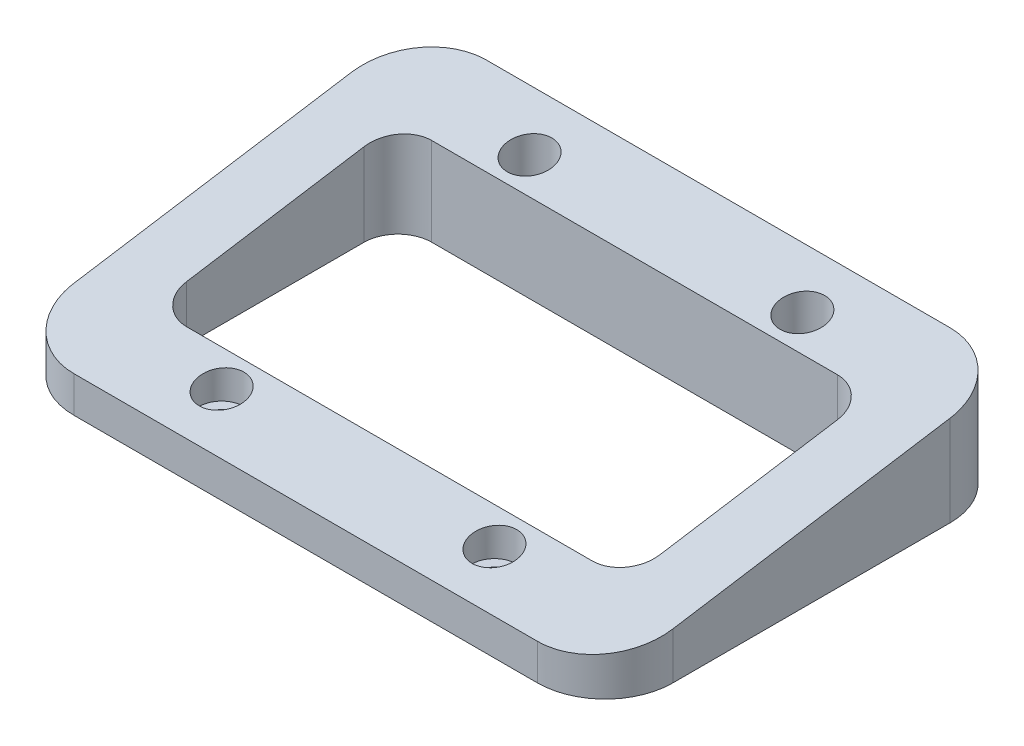
ISO-10303-21;
HEADER;
FILE_DESCRIPTION(('STEP AP214'),'2;1');
FILE_NAME('part.step','',(''),(''),'','','');
FILE_SCHEMA(('AUTOMOTIVE_DESIGN { 1 0 10303 214 1 1 1 1 }'));
ENDSEC;
DATA;
#1=APPLICATION_CONTEXT('core data for automotive mechanical design processes');
#2=APPLICATION_PROTOCOL_DEFINITION('international standard','automotive_design',2000,#1);
#3=PRODUCT_CONTEXT('',#1,'mechanical');
#4=PRODUCT('Part','Part','',(#3));
#5=PRODUCT_RELATED_PRODUCT_CATEGORY('part','',(#4));
#6=PRODUCT_DEFINITION_FORMATION('','',#4);
#7=PRODUCT_DEFINITION_CONTEXT('part definition',#1,'design');
#8=PRODUCT_DEFINITION('design','',#6,#7);
#9=PRODUCT_DEFINITION_SHAPE('','',#8);
#10=(LENGTH_UNIT() NAMED_UNIT(*) SI_UNIT(.MILLI.,.METRE.));
#11=(NAMED_UNIT(*) PLANE_ANGLE_UNIT() SI_UNIT($,.RADIAN.));
#12=(NAMED_UNIT(*) SI_UNIT($,.STERADIAN.) SOLID_ANGLE_UNIT());
#13=UNCERTAINTY_MEASURE_WITH_UNIT(LENGTH_MEASURE(1.E-05),#10,'distance_accuracy_value','');
#14=(GEOMETRIC_REPRESENTATION_CONTEXT(3) GLOBAL_UNCERTAINTY_ASSIGNED_CONTEXT((#13)) GLOBAL_UNIT_ASSIGNED_CONTEXT((#10,
#11,#12)) REPRESENTATION_CONTEXT('',''));
#15=CARTESIAN_POINT('',(0.,0.,0.));
#16=DIRECTION('',(0.,0.,1.));
#17=DIRECTION('',(1.,0.,0.));
#18=AXIS2_PLACEMENT_3D('',#15,#16,#17);
#19=CARTESIAN_POINT('',(81.8747524998957,0.,21.3119442239792));
#20=DIRECTION('',(0.,-1.,0.));
#21=DIRECTION('',(0.,0.,-1.));
#22=AXIS2_PLACEMENT_3D('',#19,#20,#21);
#23=PLANE('',#22);
#24=CARTESIAN_POINT('',(67.5372524998957,0.,23.6119442239792));
#25=DIRECTION('',(0.,1.,0.));
#26=DIRECTION('',(0.,0.,1.));
#27=AXIS2_PLACEMENT_3D('',#24,#25,#26);
#28=CIRCLE('',#27,1.8);
#29=CARTESIAN_POINT('',(67.5372524998957,0.,25.4119442239792));
#30=VERTEX_POINT('',#29);
#31=EDGE_CURVE('E308',#30,#30,#28,.T.);
#32=ORIENTED_EDGE('',*,*,#31,.T.);
#33=EDGE_LOOP('',(#32));
#34=FACE_BOUND('',#33,.T.);
#35=CARTESIAN_POINT('',(26.5322524998958,0.,23.6119442239792));
#36=DIRECTION('',(0.,1.,0.));
#37=DIRECTION('',(0.,0.,1.));
#38=AXIS2_PLACEMENT_3D('',#35,#36,#37);
#39=CIRCLE('',#38,1.8);
#40=CARTESIAN_POINT('',(26.5322524998958,0.,25.4119442239792));
#41=VERTEX_POINT('',#40);
#42=EDGE_CURVE('E322',#41,#41,#39,.T.);
#43=ORIENTED_EDGE('',*,*,#42,.T.);
#44=EDGE_LOOP('',(#43));
#45=FACE_BOUND('',#44,.T.);
#46=CARTESIAN_POINT('',(26.5322524998958,0.,-22.6680557760208));
#47=DIRECTION('',(0.,1.,0.));
#48=DIRECTION('',(0.,0.,1.));
#49=AXIS2_PLACEMENT_3D('',#46,#47,#48);
#50=CIRCLE('',#49,1.8);
#51=CARTESIAN_POINT('',(26.5322524998958,0.,-20.8680557760208));
#52=VERTEX_POINT('',#51);
#53=EDGE_CURVE('E334',#52,#52,#50,.T.);
#54=ORIENTED_EDGE('',*,*,#53,.T.);
#55=EDGE_LOOP('',(#54));
#56=FACE_BOUND('',#55,.T.);
#57=CARTESIAN_POINT('',(67.5372524998957,0.,-22.6680557760208));
#58=DIRECTION('',(0.,1.,0.));
#59=DIRECTION('',(0.,0.,1.));
#60=AXIS2_PLACEMENT_3D('',#57,#58,#59);
#61=CIRCLE('',#60,1.8);
#62=CARTESIAN_POINT('',(67.5372524998957,0.,-20.8680557760208));
#63=VERTEX_POINT('',#62);
#64=EDGE_CURVE('E346',#63,#63,#61,.T.);
#65=ORIENTED_EDGE('',*,*,#64,.T.);
#66=EDGE_LOOP('',(#65));
#67=FACE_BOUND('',#66,.T.);
#68=DIRECTION('',(0.,0.,1.));
#69=VECTOR('',#68,1.);
#70=CARTESIAN_POINT('',(92.0347524998957,0.,-20.3680557760208));
#71=LINE('',#70,#69);
#72=CARTESIAN_POINT('',(92.0347524998957,0.,-20.3680557760208));
#73=VERTEX_POINT('',#72);
#74=CARTESIAN_POINT('',(92.0347524998957,0.,21.3119442239792));
#75=VERTEX_POINT('',#74);
#76=EDGE_CURVE('E242',#73,#75,#71,.T.);
#77=ORIENTED_EDGE('',*,*,#76,.T.);
#78=CARTESIAN_POINT('',(81.8747524998957,0.,21.3119442239792));
#79=DIRECTION('',(0.,-1.,0.));
#80=DIRECTION('',(0.,0.,-1.));
#81=AXIS2_PLACEMENT_3D('',#78,#79,#80);
#82=CIRCLE('',#81,10.16);
#83=CARTESIAN_POINT('',(81.8747524998957,0.,31.4719442239792));
#84=VERTEX_POINT('',#83);
#85=EDGE_CURVE('E246',#75,#84,#82,.T.);
#86=ORIENTED_EDGE('',*,*,#85,.T.);
#87=DIRECTION('',(-1.,0.,0.));
#88=VECTOR('',#87,1.);
#89=CARTESIAN_POINT('',(81.8747524998957,0.,31.4719442239792));
#90=LINE('',#89,#88);
#91=CARTESIAN_POINT('',(12.1947524998957,0.,31.4719442239793));
#92=VERTEX_POINT('',#91);
#93=EDGE_CURVE('E250',#84,#92,#90,.T.);
#94=ORIENTED_EDGE('',*,*,#93,.T.);
#95=CARTESIAN_POINT('',(12.1947524998957,0.,21.3119442239793));
#96=DIRECTION('',(0.,-1.,0.));
#97=DIRECTION('',(0.,0.,-1.));
#98=AXIS2_PLACEMENT_3D('',#95,#96,#97);
#99=CIRCLE('',#98,10.16);
#100=CARTESIAN_POINT('',(2.03475249989575,0.,21.3119442239793));
#101=VERTEX_POINT('',#100);
#102=EDGE_CURVE('E254',#92,#101,#99,.T.);
#103=ORIENTED_EDGE('',*,*,#102,.T.);
#104=DIRECTION('',(0.,0.,1.));
#105=VECTOR('',#104,1.);
#106=CARTESIAN_POINT('',(2.03475249989574,0.,-20.3680557760207));
#107=LINE('',#106,#105);
#108=CARTESIAN_POINT('',(2.03475249989574,0.,-20.3680557760207));
#109=VERTEX_POINT('',#108);
#110=EDGE_CURVE('E258',#109,#101,#107,.T.);
#111=ORIENTED_EDGE('',*,*,#110,.F.);
#112=CARTESIAN_POINT('',(12.1947524998957,0.,-20.3680557760207));
#113=DIRECTION('',(0.,-1.,0.));
#114=DIRECTION('',(0.,0.,-1.));
#115=AXIS2_PLACEMENT_3D('',#112,#113,#114);
#116=CIRCLE('',#115,10.16);
#117=CARTESIAN_POINT('',(12.1947524998957,0.,-30.5280557760207));
#118=VERTEX_POINT('',#117);
#119=EDGE_CURVE('E262',#109,#118,#116,.T.);
#120=ORIENTED_EDGE('',*,*,#119,.T.);
#121=DIRECTION('',(-1.,0.,0.));
#122=VECTOR('',#121,1.);
#123=CARTESIAN_POINT('',(81.8747524998957,0.,-30.5280557760208));
#124=LINE('',#123,#122);
#125=CARTESIAN_POINT('',(81.8747524998957,0.,-30.5280557760208));
#126=VERTEX_POINT('',#125);
#127=EDGE_CURVE('E236',#126,#118,#124,.T.);
#128=ORIENTED_EDGE('',*,*,#127,.F.);
#129=CARTESIAN_POINT('',(81.8747524998957,0.,-20.3680557760208));
#130=DIRECTION('',(0.,1.,0.));
#131=DIRECTION('',(0.,0.,1.));
#132=AXIS2_PLACEMENT_3D('',#129,#130,#131);
#133=CIRCLE('',#132,10.16);
#134=EDGE_CURVE('E220',#73,#126,#133,.T.);
#135=ORIENTED_EDGE('',*,*,#134,.F.);
#136=EDGE_LOOP('',(#77,#86,#94,#103,#111,#120,#128,#135));
#137=FACE_BOUND('',#136,.T.);
#138=CARTESIAN_POINT('',(16.5547524998958,0.,-12.8630557760208));
#139=DIRECTION('',(0.,-1.,0.));
#140=DIRECTION('',(0.,0.,-1.));
#141=AXIS2_PLACEMENT_3D('',#138,#139,#140);
#142=CIRCLE('',#141,5.08);
#143=CARTESIAN_POINT('',(11.4747524998958,0.,-12.8630557760207));
#144=VERTEX_POINT('',#143);
#145=CARTESIAN_POINT('',(16.5547524998958,0.,-17.9430557760208));
#146=VERTEX_POINT('',#145);
#147=EDGE_CURVE('E417',#144,#146,#142,.T.);
#148=ORIENTED_EDGE('',*,*,#147,.F.);
#149=DIRECTION('',(0.,0.,1.));
#150=VECTOR('',#149,1.);
#151=CARTESIAN_POINT('',(11.4747524998958,0.,-12.8630557760207));
#152=LINE('',#151,#150);
#153=CARTESIAN_POINT('',(11.4747524998958,0.,13.8069442239792));
#154=VERTEX_POINT('',#153);
#155=EDGE_CURVE('E213',#144,#154,#152,.T.);
#156=ORIENTED_EDGE('',*,*,#155,.T.);
#157=CARTESIAN_POINT('',(16.5547524998958,0.,13.8069442239792));
#158=DIRECTION('',(0.,-1.,0.));
#159=DIRECTION('',(0.,0.,-1.));
#160=AXIS2_PLACEMENT_3D('',#157,#158,#159);
#161=CIRCLE('',#160,5.08);
#162=CARTESIAN_POINT('',(16.5547524998958,0.,18.8869442239792));
#163=VERTEX_POINT('',#162);
#164=EDGE_CURVE('E393',#163,#154,#161,.T.);
#165=ORIENTED_EDGE('',*,*,#164,.F.);
#166=DIRECTION('',(1.,0.,0.));
#167=VECTOR('',#166,1.);
#168=CARTESIAN_POINT('',(16.5547524998958,0.,18.8869442239792));
#169=LINE('',#168,#167);
#170=CARTESIAN_POINT('',(77.5147524998957,0.,18.8869442239792));
#171=VERTEX_POINT('',#170);
#172=EDGE_CURVE('E397',#163,#171,#169,.T.);
#173=ORIENTED_EDGE('',*,*,#172,.T.);
#174=CARTESIAN_POINT('',(77.5147524998957,0.,13.8069442239792));
#175=DIRECTION('',(0.,-1.,0.));
#176=DIRECTION('',(0.,0.,-1.));
#177=AXIS2_PLACEMENT_3D('',#174,#175,#176);
#178=CIRCLE('',#177,5.08);
#179=CARTESIAN_POINT('',(82.5947524998958,0.,13.8069442239792));
#180=VERTEX_POINT('',#179);
#181=EDGE_CURVE('E401',#180,#171,#178,.T.);
#182=ORIENTED_EDGE('',*,*,#181,.F.);
#183=DIRECTION('',(0.,0.,1.));
#184=VECTOR('',#183,1.);
#185=CARTESIAN_POINT('',(82.5947524998957,0.,-12.8630557760207));
#186=LINE('',#185,#184);
#187=CARTESIAN_POINT('',(82.5947524998957,0.,-12.8630557760207));
#188=VERTEX_POINT('',#187);
#189=EDGE_CURVE('E405',#188,#180,#186,.T.);
#190=ORIENTED_EDGE('',*,*,#189,.F.);
#191=CARTESIAN_POINT('',(77.5147524998957,0.,-12.8630557760208));
#192=DIRECTION('',(0.,-1.,0.));
#193=DIRECTION('',(0.,0.,-1.));
#194=AXIS2_PLACEMENT_3D('',#191,#192,#193);
#195=CIRCLE('',#194,5.08);
#196=CARTESIAN_POINT('',(77.5147524998957,0.,-17.9430557760208));
#197=VERTEX_POINT('',#196);
#198=EDGE_CURVE('E409',#197,#188,#195,.T.);
#199=ORIENTED_EDGE('',*,*,#198,.F.);
#200=DIRECTION('',(1.,0.,0.));
#201=VECTOR('',#200,1.);
#202=CARTESIAN_POINT('',(16.5547524998958,0.,-17.9430557760208));
#203=LINE('',#202,#201);
#204=EDGE_CURVE('E413',#146,#197,#203,.T.);
#205=ORIENTED_EDGE('',*,*,#204,.F.);
#206=EDGE_LOOP('',(#148,#156,#165,#173,#182,#190,#199,#205));
#207=FACE_BOUND('',#206,.T.);
#208=ADVANCED_FACE('F89',(#34,#45,#56,#67,#137,#207),#23,.T.);
#209=CARTESIAN_POINT('',(92.0347524998957,15.24,-20.3680557760208));
#210=DIRECTION('',(1.,0.,0.));
#211=DIRECTION('',(0.,0.,-1.));
#212=AXIS2_PLACEMENT_3D('',#209,#210,#211);
#213=PLANE('',#212);
#214=DIRECTION('',(0.,-0.156434465040224,0.987688340595139));
#215=VECTOR('',#214,1.);
#216=CARTESIAN_POINT('',(92.0347524998957,15.24,-30.5280557760208));
#217=LINE('',#216,#215);
#218=CARTESIAN_POINT('',(92.0347524998957,13.6308140863028,-20.3680557760208));
#219=VERTEX_POINT('',#218);
#220=CARTESIAN_POINT('',(92.0347524998957,7.0293506135764,21.3119442239792));
#221=VERTEX_POINT('',#220);
#222=EDGE_CURVE('E209',#219,#221,#217,.T.);
#223=ORIENTED_EDGE('',*,*,#222,.T.);
#224=DIRECTION('',(0.,-1.,0.));
#225=VECTOR('',#224,1.);
#226=CARTESIAN_POINT('',(92.0347524998957,15.24,21.3119442239792));
#227=LINE('',#226,#225);
#228=EDGE_CURVE('E230',#221,#75,#227,.T.);
#229=ORIENTED_EDGE('',*,*,#228,.T.);
#230=ORIENTED_EDGE('',*,*,#76,.F.);
#231=DIRECTION('',(0.,-1.,0.));
#232=VECTOR('',#231,1.);
#233=CARTESIAN_POINT('',(92.0347524998957,15.24,-20.3680557760208));
#234=LINE('',#233,#232);
#235=EDGE_CURVE('E99',#219,#73,#234,.T.);
#236=ORIENTED_EDGE('',*,*,#235,.F.);
#237=EDGE_LOOP('',(#223,#229,#230,#236));
#238=FACE_BOUND('',#237,.T.);
#239=ADVANCED_FACE('F91',(#238),#213,.T.);
#240=CARTESIAN_POINT('',(81.8747524998957,15.24,-20.3680557760208));
#241=DIRECTION('',(0.,-1.,0.));
#242=DIRECTION('',(0.,0.,-1.));
#243=AXIS2_PLACEMENT_3D('',#240,#241,#242);
#244=CYLINDRICAL_SURFACE('',#243,10.16);
#245=DIRECTION('',(0.,-1.,0.));
#246=VECTOR('',#245,1.);
#247=CARTESIAN_POINT('',(81.8747524998957,15.24,-30.5280557760208));
#248=LINE('',#247,#246);
#249=CARTESIAN_POINT('',(81.8747524998957,15.24,-30.5280557760208));
#250=VERTEX_POINT('',#249);
#251=EDGE_CURVE('E217',#250,#126,#248,.T.);
#252=ORIENTED_EDGE('',*,*,#251,.F.);
#253=CARTESIAN_POINT('',(81.8747524998957,13.6308140863028,-20.3680557760208));
#254=DIRECTION('',(0.,-0.987688340595139,-0.156434465040224));
#255=DIRECTION('',(0.,-0.156434465040224,0.987688340595139));
#256=AXIS2_PLACEMENT_3D('',#253,#254,#255);
#257=ELLIPSE('',#256,10.2866456780061,10.16);
#258=EDGE_CURVE('E202',#250,#219,#257,.T.);
#259=ORIENTED_EDGE('',*,*,#258,.T.);
#260=ORIENTED_EDGE('',*,*,#235,.T.);
#261=ORIENTED_EDGE('',*,*,#134,.T.);
#262=EDGE_LOOP('',(#252,#259,#260,#261));
#263=FACE_BOUND('',#262,.T.);
#264=ADVANCED_FACE('F218',(#263),#244,.T.);
#265=CARTESIAN_POINT('',(81.8747524998957,15.24,-30.5280557760208));
#266=DIRECTION('',(0.,0.,1.));
#267=DIRECTION('',(1.,0.,0.));
#268=AXIS2_PLACEMENT_3D('',#265,#266,#267);
#269=PLANE('',#268);
#270=ORIENTED_EDGE('',*,*,#127,.T.);
#271=DIRECTION('',(0.,-1.,0.));
#272=VECTOR('',#271,1.);
#273=CARTESIAN_POINT('',(12.1947524998957,15.24,-30.5280557760207));
#274=LINE('',#273,#272);
#275=CARTESIAN_POINT('',(12.1947524998957,15.24,-30.5280557760207));
#276=VERTEX_POINT('',#275);
#277=EDGE_CURVE('E225',#276,#118,#274,.T.);
#278=ORIENTED_EDGE('',*,*,#277,.F.);
#279=DIRECTION('',(-1.,0.,0.));
#280=VECTOR('',#279,1.);
#281=CARTESIAN_POINT('',(81.8747524998957,15.24,-30.5280557760208));
#282=LINE('',#281,#280);
#283=EDGE_CURVE('E206',#250,#276,#282,.T.);
#284=ORIENTED_EDGE('',*,*,#283,.F.);
#285=ORIENTED_EDGE('',*,*,#251,.T.);
#286=EDGE_LOOP('',(#270,#278,#284,#285));
#287=FACE_BOUND('',#286,.T.);
#288=ADVANCED_FACE('F228',(#287),#269,.F.);
#289=CARTESIAN_POINT('',(12.1947524998957,15.24,-20.3680557760207));
#290=DIRECTION('',(0.,-1.,0.));
#291=DIRECTION('',(0.,0.,-1.));
#292=AXIS2_PLACEMENT_3D('',#289,#290,#291);
#293=CYLINDRICAL_SURFACE('',#292,10.16);
#294=CARTESIAN_POINT('',(12.1947524998957,13.6308140863028,-20.3680557760207));
#295=DIRECTION('',(0.,-0.987688340595139,-0.156434465040224));
#296=DIRECTION('',(0.,-0.156434465040224,0.987688340595139));
#297=AXIS2_PLACEMENT_3D('',#294,#295,#296);
#298=ELLIPSE('',#297,10.2866456780061,10.16);
#299=CARTESIAN_POINT('',(2.03475249989574,13.6308140863028,-20.3680557760207));
#300=VERTEX_POINT('',#299);
#301=EDGE_CURVE('E214',#276,#300,#298,.F.);
#302=ORIENTED_EDGE('',*,*,#301,.F.);
#303=ORIENTED_EDGE('',*,*,#277,.T.);
#304=ORIENTED_EDGE('',*,*,#119,.F.);
#305=DIRECTION('',(0.,-1.,0.));
#306=VECTOR('',#305,1.);
#307=CARTESIAN_POINT('',(2.03475249989574,15.24,-20.3680557760207));
#308=LINE('',#307,#306);
#309=EDGE_CURVE('E272',#300,#109,#308,.T.);
#310=ORIENTED_EDGE('',*,*,#309,.F.);
#311=EDGE_LOOP('',(#302,#303,#304,#310));
#312=FACE_BOUND('',#311,.T.);
#313=ADVANCED_FACE('F497',(#312),#293,.T.);
#314=CARTESIAN_POINT('',(2.03475249989574,15.24,-20.3680557760207));
#315=DIRECTION('',(1.,0.,0.));
#316=DIRECTION('',(0.,0.,-1.));
#317=AXIS2_PLACEMENT_3D('',#314,#315,#316);
#318=PLANE('',#317);
#319=DIRECTION('',(0.,-1.,0.));
#320=VECTOR('',#319,1.);
#321=CARTESIAN_POINT('',(2.03475249989575,15.24,21.3119442239793));
#322=LINE('',#321,#320);
#323=CARTESIAN_POINT('',(2.03475249989574,7.0293506135764,21.3119442239793));
#324=VERTEX_POINT('',#323);
#325=EDGE_CURVE('E275',#324,#101,#322,.T.);
#326=ORIENTED_EDGE('',*,*,#325,.F.);
#327=DIRECTION('',(0.,-0.156434465040224,0.987688340595139));
#328=VECTOR('',#327,1.);
#329=CARTESIAN_POINT('',(2.03475249989574,15.24,-30.5280557760207));
#330=LINE('',#329,#328);
#331=EDGE_CURVE('E350',#300,#324,#330,.T.);
#332=ORIENTED_EDGE('',*,*,#331,.F.);
#333=ORIENTED_EDGE('',*,*,#309,.T.);
#334=ORIENTED_EDGE('',*,*,#110,.T.);
#335=EDGE_LOOP('',(#326,#332,#333,#334));
#336=FACE_BOUND('',#335,.T.);
#337=ADVANCED_FACE('F500',(#336),#318,.F.);
#338=CARTESIAN_POINT('',(12.1947524998957,15.24,21.3119442239793));
#339=DIRECTION('',(0.,-1.,0.));
#340=DIRECTION('',(0.,0.,-1.));
#341=AXIS2_PLACEMENT_3D('',#338,#339,#340);
#342=CYLINDRICAL_SURFACE('',#341,10.16);
#343=CARTESIAN_POINT('',(12.1947524998957,7.0293506135764,21.3119442239793));
#344=DIRECTION('',(0.,-0.987688340595139,-0.156434465040224));
#345=DIRECTION('',(0.,-0.156434465040224,0.987688340595139));
#346=AXIS2_PLACEMENT_3D('',#343,#344,#345);
#347=ELLIPSE('',#346,10.2866456780061,10.16);
#348=CARTESIAN_POINT('',(12.1947524998958,5.42016469987918,31.4719442239792));
#349=VERTEX_POINT('',#348);
#350=EDGE_CURVE('E385',#324,#349,#347,.F.);
#351=ORIENTED_EDGE('',*,*,#350,.F.);
#352=ORIENTED_EDGE('',*,*,#325,.T.);
#353=ORIENTED_EDGE('',*,*,#102,.F.);
#354=DIRECTION('',(0.,-1.,0.));
#355=VECTOR('',#354,1.);
#356=CARTESIAN_POINT('',(12.1947524998957,15.24,31.4719442239793));
#357=LINE('',#356,#355);
#358=EDGE_CURVE('E278',#349,#92,#357,.T.);
#359=ORIENTED_EDGE('',*,*,#358,.F.);
#360=EDGE_LOOP('',(#351,#352,#353,#359));
#361=FACE_BOUND('',#360,.T.);
#362=ADVANCED_FACE('F504',(#361),#342,.T.);
#363=CARTESIAN_POINT('',(81.8747524998957,15.24,31.4719442239792));
#364=DIRECTION('',(0.,0.,1.));
#365=DIRECTION('',(1.,0.,0.));
#366=AXIS2_PLACEMENT_3D('',#363,#364,#365);
#367=PLANE('',#366);
#368=DIRECTION('',(-1.,0.,0.));
#369=VECTOR('',#368,1.);
#370=CARTESIAN_POINT('',(92.0347524998957,5.42016469987918,31.4719442239792));
#371=LINE('',#370,#369);
#372=CARTESIAN_POINT('',(81.8747524998957,5.42016469987918,31.4719442239792));
#373=VERTEX_POINT('',#372);
#374=EDGE_CURVE('E107',#373,#349,#371,.T.);
#375=ORIENTED_EDGE('',*,*,#374,.T.);
#376=ORIENTED_EDGE('',*,*,#358,.T.);
#377=ORIENTED_EDGE('',*,*,#93,.F.);
#378=DIRECTION('',(0.,-1.,0.));
#379=VECTOR('',#378,1.);
#380=CARTESIAN_POINT('',(81.8747524998957,15.24,31.4719442239792));
#381=LINE('',#380,#379);
#382=EDGE_CURVE('E234',#373,#84,#381,.T.);
#383=ORIENTED_EDGE('',*,*,#382,.F.);
#384=EDGE_LOOP('',(#375,#376,#377,#383));
#385=FACE_BOUND('',#384,.T.);
#386=ADVANCED_FACE('F508',(#385),#367,.T.);
#387=CARTESIAN_POINT('',(81.8747524998957,15.24,21.3119442239792));
#388=DIRECTION('',(0.,-1.,0.));
#389=DIRECTION('',(0.,0.,-1.));
#390=AXIS2_PLACEMENT_3D('',#387,#388,#389);
#391=CYLINDRICAL_SURFACE('',#390,10.16);
#392=CARTESIAN_POINT('',(81.8747524998957,7.0293506135764,21.3119442239792));
#393=DIRECTION('',(0.,-0.987688340595139,-0.156434465040224));
#394=DIRECTION('',(0.,-0.156434465040224,0.987688340595139));
#395=AXIS2_PLACEMENT_3D('',#392,#393,#394);
#396=ELLIPSE('',#395,10.2866456780061,10.16);
#397=EDGE_CURVE('E382',#373,#221,#396,.F.);
#398=ORIENTED_EDGE('',*,*,#397,.F.);
#399=ORIENTED_EDGE('',*,*,#382,.T.);
#400=ORIENTED_EDGE('',*,*,#85,.F.);
#401=ORIENTED_EDGE('',*,*,#228,.F.);
#402=EDGE_LOOP('',(#398,#399,#400,#401));
#403=FACE_BOUND('',#402,.T.);
#404=ADVANCED_FACE('F511',(#403),#391,.T.);
#405=CARTESIAN_POINT('',(11.4747524998958,15.24,-12.8630557760207));
#406=DIRECTION('',(1.,0.,0.));
#407=DIRECTION('',(0.,0.,-1.));
#408=AXIS2_PLACEMENT_3D('',#405,#406,#407);
#409=PLANE('',#408);
#410=DIRECTION('',(0.,0.156434465040224,-0.987688340595139));
#411=VECTOR('',#410,1.);
#412=CARTESIAN_POINT('',(11.4747524998958,12.5106073971834,-13.2953490958437));
#413=LINE('',#412,#411);
#414=CARTESIAN_POINT('',(11.4747524998958,8.218025838212,13.8069442239792));
#415=VERTEX_POINT('',#414);
#416=CARTESIAN_POINT('',(11.4747524998958,12.4421388616672,-12.8630557760207));
#417=VERTEX_POINT('',#416);
#418=EDGE_CURVE('E115',#415,#417,#413,.T.);
#419=ORIENTED_EDGE('',*,*,#418,.F.);
#420=DIRECTION('',(0.,-1.,0.));
#421=VECTOR('',#420,1.);
#422=CARTESIAN_POINT('',(11.4747524998958,15.24,13.8069442239792));
#423=LINE('',#422,#421);
#424=EDGE_CURVE('E240',#415,#154,#423,.T.);
#425=ORIENTED_EDGE('',*,*,#424,.T.);
#426=ORIENTED_EDGE('',*,*,#155,.F.);
#427=DIRECTION('',(0.,-1.,0.));
#428=VECTOR('',#427,1.);
#429=CARTESIAN_POINT('',(11.4747524998958,15.24,-12.8630557760207));
#430=LINE('',#429,#428);
#431=EDGE_CURVE('E421',#417,#144,#430,.T.);
#432=ORIENTED_EDGE('',*,*,#431,.F.);
#433=EDGE_LOOP('',(#419,#425,#426,#432));
#434=FACE_BOUND('',#433,.T.);
#435=ADVANCED_FACE('F447',(#434),#409,.T.);
#436=CARTESIAN_POINT('',(16.5547524998958,15.24,13.8069442239792));
#437=DIRECTION('',(0.,-1.,0.));
#438=DIRECTION('',(0.,0.,-1.));
#439=AXIS2_PLACEMENT_3D('',#436,#437,#438);
#440=CYLINDRICAL_SURFACE('',#439,5.08);
#441=ORIENTED_EDGE('',*,*,#424,.F.);
#442=CARTESIAN_POINT('',(16.5547524998958,8.21802583821199,13.8069442239792));
#443=DIRECTION('',(0.,-0.987688340595139,-0.156434465040224));
#444=DIRECTION('',(0.,-0.156434465040224,0.987688340595139));
#445=AXIS2_PLACEMENT_3D('',#442,#443,#444);
#446=ELLIPSE('',#445,5.14332283900305,5.08);
#447=CARTESIAN_POINT('',(16.5547524998958,7.41343288136339,18.8869442239792));
#448=VERTEX_POINT('',#447);
#449=EDGE_CURVE('E376',#415,#448,#446,.F.);
#450=ORIENTED_EDGE('',*,*,#449,.T.);
#451=DIRECTION('',(0.,-1.,0.));
#452=VECTOR('',#451,1.);
#453=CARTESIAN_POINT('',(16.5547524998958,15.24,18.8869442239792));
#454=LINE('',#453,#452);
#455=EDGE_CURVE('E438',#448,#163,#454,.T.);
#456=ORIENTED_EDGE('',*,*,#455,.T.);
#457=ORIENTED_EDGE('',*,*,#164,.T.);
#458=EDGE_LOOP('',(#441,#450,#456,#457));
#459=FACE_BOUND('',#458,.T.);
#460=ADVANCED_FACE('F451',(#459),#440,.F.);
#461=CARTESIAN_POINT('',(16.5547524998958,15.24,18.8869442239792));
#462=DIRECTION('',(0.,0.,-1.));
#463=DIRECTION('',(-1.,0.,0.));
#464=AXIS2_PLACEMENT_3D('',#461,#462,#463);
#465=PLANE('',#464);
#466=DIRECTION('',(-1.,0.,0.));
#467=VECTOR('',#466,1.);
#468=CARTESIAN_POINT('',(16.5547524998958,7.41343288136339,18.8869442239792));
#469=LINE('',#468,#467);
#470=CARTESIAN_POINT('',(77.5147524998957,7.41343288136339,18.8869442239792));
#471=VERTEX_POINT('',#470);
#472=EDGE_CURVE('E373',#471,#448,#469,.T.);
#473=ORIENTED_EDGE('',*,*,#472,.F.);
#474=DIRECTION('',(0.,-1.,0.));
#475=VECTOR('',#474,1.);
#476=CARTESIAN_POINT('',(77.5147524998957,15.24,18.8869442239792));
#477=LINE('',#476,#475);
#478=EDGE_CURVE('E436',#471,#171,#477,.T.);
#479=ORIENTED_EDGE('',*,*,#478,.T.);
#480=ORIENTED_EDGE('',*,*,#172,.F.);
#481=ORIENTED_EDGE('',*,*,#455,.F.);
#482=EDGE_LOOP('',(#473,#479,#480,#481));
#483=FACE_BOUND('',#482,.T.);
#484=ADVANCED_FACE('F474',(#483),#465,.T.);
#485=CARTESIAN_POINT('',(77.5147524998957,15.24,13.8069442239792));
#486=DIRECTION('',(0.,-1.,0.));
#487=DIRECTION('',(0.,0.,-1.));
#488=AXIS2_PLACEMENT_3D('',#485,#486,#487);
#489=CYLINDRICAL_SURFACE('',#488,5.08);
#490=ORIENTED_EDGE('',*,*,#478,.F.);
#491=CARTESIAN_POINT('',(77.5147524998957,8.21802583821199,13.8069442239792));
#492=DIRECTION('',(0.,-0.987688340595139,-0.156434465040224));
#493=DIRECTION('',(0.,-0.156434465040224,0.987688340595139));
#494=AXIS2_PLACEMENT_3D('',#491,#492,#493);
#495=ELLIPSE('',#494,5.14332283900305,5.08);
#496=CARTESIAN_POINT('',(82.5947524998958,8.218025838212,13.8069442239792));
#497=VERTEX_POINT('',#496);
#498=EDGE_CURVE('E369',#471,#497,#495,.F.);
#499=ORIENTED_EDGE('',*,*,#498,.T.);
#500=DIRECTION('',(0.,-1.,0.));
#501=VECTOR('',#500,1.);
#502=CARTESIAN_POINT('',(82.5947524998958,15.24,13.8069442239792));
#503=LINE('',#502,#501);
#504=EDGE_CURVE('E433',#497,#180,#503,.T.);
#505=ORIENTED_EDGE('',*,*,#504,.T.);
#506=ORIENTED_EDGE('',*,*,#181,.T.);
#507=EDGE_LOOP('',(#490,#499,#505,#506));
#508=FACE_BOUND('',#507,.T.);
#509=ADVANCED_FACE('F471',(#508),#489,.F.);
#510=CARTESIAN_POINT('',(82.5947524998957,15.24,-12.8630557760207));
#511=DIRECTION('',(1.,0.,0.));
#512=DIRECTION('',(0.,0.,-1.));
#513=AXIS2_PLACEMENT_3D('',#510,#511,#512);
#514=PLANE('',#513);
#515=ORIENTED_EDGE('',*,*,#504,.F.);
#516=DIRECTION('',(0.,0.156434465040224,-0.987688340595139));
#517=VECTOR('',#516,1.);
#518=CARTESIAN_POINT('',(82.5947524998957,12.5106073971834,-13.2953490958437));
#519=LINE('',#518,#517);
#520=CARTESIAN_POINT('',(82.5947524998957,12.4421388616672,-12.8630557760207));
#521=VERTEX_POINT('',#520);
#522=EDGE_CURVE('E365',#497,#521,#519,.T.);
#523=ORIENTED_EDGE('',*,*,#522,.T.);
#524=DIRECTION('',(0.,-1.,0.));
#525=VECTOR('',#524,1.);
#526=CARTESIAN_POINT('',(82.5947524998957,15.24,-12.8630557760207));
#527=LINE('',#526,#525);
#528=EDGE_CURVE('E430',#521,#188,#527,.T.);
#529=ORIENTED_EDGE('',*,*,#528,.T.);
#530=ORIENTED_EDGE('',*,*,#189,.T.);
#531=EDGE_LOOP('',(#515,#523,#529,#530));
#532=FACE_BOUND('',#531,.T.);
#533=ADVANCED_FACE('F467',(#532),#514,.F.);
#534=CARTESIAN_POINT('',(77.5147524998957,15.24,-12.8630557760208));
#535=DIRECTION('',(0.,-1.,0.));
#536=DIRECTION('',(0.,0.,-1.));
#537=AXIS2_PLACEMENT_3D('',#534,#535,#536);
#538=CYLINDRICAL_SURFACE('',#537,5.08);
#539=ORIENTED_EDGE('',*,*,#528,.F.);
#540=CARTESIAN_POINT('',(77.5147524998957,12.4421388616672,-12.8630557760208));
#541=DIRECTION('',(0.,-0.987688340595139,-0.156434465040224));
#542=DIRECTION('',(0.,-0.156434465040224,0.987688340595139));
#543=AXIS2_PLACEMENT_3D('',#540,#541,#542);
#544=ELLIPSE('',#543,5.14332283900305,5.08);
#545=CARTESIAN_POINT('',(77.5147524998957,13.2467318185158,-17.9430557760208));
#546=VERTEX_POINT('',#545);
#547=EDGE_CURVE('E361',#521,#546,#544,.F.);
#548=ORIENTED_EDGE('',*,*,#547,.T.);
#549=DIRECTION('',(0.,-1.,0.));
#550=VECTOR('',#549,1.);
#551=CARTESIAN_POINT('',(77.5147524998957,15.24,-17.9430557760208));
#552=LINE('',#551,#550);
#553=EDGE_CURVE('E427',#546,#197,#552,.T.);
#554=ORIENTED_EDGE('',*,*,#553,.T.);
#555=ORIENTED_EDGE('',*,*,#198,.T.);
#556=EDGE_LOOP('',(#539,#548,#554,#555));
#557=FACE_BOUND('',#556,.T.);
#558=ADVANCED_FACE('F463',(#557),#538,.F.);
#559=CARTESIAN_POINT('',(16.5547524998958,15.24,-17.9430557760208));
#560=DIRECTION('',(0.,0.,-1.));
#561=DIRECTION('',(-1.,0.,0.));
#562=AXIS2_PLACEMENT_3D('',#559,#560,#561);
#563=PLANE('',#562);
#564=ORIENTED_EDGE('',*,*,#553,.F.);
#565=DIRECTION('',(-1.,0.,0.));
#566=VECTOR('',#565,1.);
#567=CARTESIAN_POINT('',(16.5547524998958,13.2467318185158,-17.9430557760208));
#568=LINE('',#567,#566);
#569=CARTESIAN_POINT('',(16.5547524998958,13.2467318185158,-17.9430557760208));
#570=VERTEX_POINT('',#569);
#571=EDGE_CURVE('E357',#546,#570,#568,.T.);
#572=ORIENTED_EDGE('',*,*,#571,.T.);
#573=DIRECTION('',(0.,-1.,0.));
#574=VECTOR('',#573,1.);
#575=CARTESIAN_POINT('',(16.5547524998958,15.24,-17.9430557760208));
#576=LINE('',#575,#574);
#577=EDGE_CURVE('E424',#570,#146,#576,.T.);
#578=ORIENTED_EDGE('',*,*,#577,.T.);
#579=ORIENTED_EDGE('',*,*,#204,.T.);
#580=EDGE_LOOP('',(#564,#572,#578,#579));
#581=FACE_BOUND('',#580,.T.);
#582=ADVANCED_FACE('F460',(#581),#563,.F.);
#583=CARTESIAN_POINT('',(16.5547524998958,15.24,-12.8630557760208));
#584=DIRECTION('',(0.,-1.,0.));
#585=DIRECTION('',(0.,0.,-1.));
#586=AXIS2_PLACEMENT_3D('',#583,#584,#585);
#587=CYLINDRICAL_SURFACE('',#586,5.08);
#588=ORIENTED_EDGE('',*,*,#577,.F.);
#589=CARTESIAN_POINT('',(16.5547524998958,12.4421388616672,-12.8630557760208));
#590=DIRECTION('',(0.,-0.987688340595139,-0.156434465040224));
#591=DIRECTION('',(0.,-0.156434465040224,0.987688340595139));
#592=AXIS2_PLACEMENT_3D('',#589,#590,#591);
#593=ELLIPSE('',#592,5.14332283900305,5.08);
#594=EDGE_CURVE('E12',#570,#417,#593,.F.);
#595=ORIENTED_EDGE('',*,*,#594,.T.);
#596=ORIENTED_EDGE('',*,*,#431,.T.);
#597=ORIENTED_EDGE('',*,*,#147,.T.);
#598=EDGE_LOOP('',(#588,#595,#596,#597));
#599=FACE_BOUND('',#598,.T.);
#600=ADVANCED_FACE('F457',(#599),#587,.F.);
#601=CARTESIAN_POINT('',(92.0347524998957,15.24,-30.5280557760208));
#602=DIRECTION('',(0.,-0.987688340595139,-0.156434465040224));
#603=DIRECTION('',(0.,0.156434465040224,-0.987688340595139));
#604=AXIS2_PLACEMENT_3D('',#601,#602,#603);
#605=PLANE('',#604);
#606=CARTESIAN_POINT('',(26.5322524998958,6.66506640082999,23.6119442239792));
#607=DIRECTION('',(0.,-0.987688340595139,-0.156434465040224));
#608=DIRECTION('',(0.,-0.156434465040224,0.987688340595139));
#609=AXIS2_PLACEMENT_3D('',#606,#607,#608);
#610=ELLIPSE('',#609,3.3917581713898,3.34999999999999);
#611=CARTESIAN_POINT('',(26.5322524998958,6.13447852574281,26.9619442239792));
#612=VERTEX_POINT('',#611);
#613=EDGE_CURVE('E93',#612,#612,#610,.T.);
#614=ORIENTED_EDGE('',*,*,#613,.T.);
#615=EDGE_LOOP('',(#614));
#616=FACE_BOUND('',#615,.T.);
#617=CARTESIAN_POINT('',(67.5372524998957,13.9950982990492,-22.6680557760208));
#618=DIRECTION('',(0.,-0.987688340595139,-0.156434465040224));
#619=DIRECTION('',(0.,-0.156434465040224,0.987688340595139));
#620=AXIS2_PLACEMENT_3D('',#617,#618,#619);
#621=ELLIPSE('',#620,3.39175817138979,3.34999999999999);
#622=CARTESIAN_POINT('',(67.5372524998957,13.464510423962,-19.3180557760208));
#623=VERTEX_POINT('',#622);
#624=EDGE_CURVE('E290',#623,#623,#621,.T.);
#625=ORIENTED_EDGE('',*,*,#624,.T.);
#626=EDGE_LOOP('',(#625));
#627=FACE_BOUND('',#626,.T.);
#628=CARTESIAN_POINT('',(26.5322524998958,13.9950982990492,-22.6680557760208));
#629=DIRECTION('',(0.,-0.987688340595139,-0.156434465040224));
#630=DIRECTION('',(0.,-0.156434465040224,0.987688340595139));
#631=AXIS2_PLACEMENT_3D('',#628,#629,#630);
#632=ELLIPSE('',#631,3.3917581713898,3.34999999999999);
#633=CARTESIAN_POINT('',(26.5322524998958,13.464510423962,-19.3180557760208));
#634=VERTEX_POINT('',#633);
#635=EDGE_CURVE('E287',#634,#634,#632,.T.);
#636=ORIENTED_EDGE('',*,*,#635,.T.);
#637=EDGE_LOOP('',(#636));
#638=FACE_BOUND('',#637,.T.);
#639=CARTESIAN_POINT('',(67.5372524998957,6.66506640082998,23.6119442239792));
#640=DIRECTION('',(0.,-0.987688340595139,-0.156434465040224));
#641=DIRECTION('',(0.,-0.156434465040224,0.987688340595139));
#642=AXIS2_PLACEMENT_3D('',#639,#640,#641);
#643=ELLIPSE('',#642,3.39175817138979,3.34999999999999);
#644=CARTESIAN_POINT('',(67.5372524998957,6.13447852574281,26.9619442239792));
#645=VERTEX_POINT('',#644);
#646=EDGE_CURVE('E283',#645,#645,#643,.T.);
#647=ORIENTED_EDGE('',*,*,#646,.T.);
#648=EDGE_LOOP('',(#647));
#649=FACE_BOUND('',#648,.T.);
#650=ORIENTED_EDGE('',*,*,#418,.T.);
#651=ORIENTED_EDGE('',*,*,#594,.F.);
#652=ORIENTED_EDGE('',*,*,#571,.F.);
#653=ORIENTED_EDGE('',*,*,#547,.F.);
#654=ORIENTED_EDGE('',*,*,#522,.F.);
#655=ORIENTED_EDGE('',*,*,#498,.F.);
#656=ORIENTED_EDGE('',*,*,#472,.T.);
#657=ORIENTED_EDGE('',*,*,#449,.F.);
#658=EDGE_LOOP('',(#650,#651,#652,#653,#654,#655,#656,#657));
#659=FACE_BOUND('',#658,.T.);
#660=ORIENTED_EDGE('',*,*,#283,.T.);
#661=ORIENTED_EDGE('',*,*,#301,.T.);
#662=ORIENTED_EDGE('',*,*,#331,.T.);
#663=ORIENTED_EDGE('',*,*,#350,.T.);
#664=ORIENTED_EDGE('',*,*,#374,.F.);
#665=ORIENTED_EDGE('',*,*,#397,.T.);
#666=ORIENTED_EDGE('',*,*,#222,.F.);
#667=ORIENTED_EDGE('',*,*,#258,.F.);
#668=EDGE_LOOP('',(#660,#661,#662,#663,#664,#665,#666,#667));
#669=FACE_BOUND('',#668,.T.);
#670=ADVANCED_FACE('F204',(#616,#627,#638,#649,#659,#669),#605,.F.);
#671=CARTESIAN_POINT('',(67.5372524998957,4.37,-22.6680557760208));
#672=DIRECTION('',(0.,1.,0.));
#673=DIRECTION('',(0.,0.,1.));
#674=AXIS2_PLACEMENT_3D('',#671,#672,#673);
#675=CYLINDRICAL_SURFACE('',#674,1.8);
#676=ORIENTED_EDGE('',*,*,#64,.F.);
#677=EDGE_LOOP('',(#676));
#678=FACE_BOUND('',#677,.T.);
#679=CARTESIAN_POINT('',(67.5372524998957,2.72,-22.6680557760208));
#680=DIRECTION('',(0.,1.,0.));
#681=DIRECTION('',(0.,0.,1.));
#682=AXIS2_PLACEMENT_3D('',#679,#680,#681);
#683=CIRCLE('',#682,1.80000000000001);
#684=CARTESIAN_POINT('',(67.5372524998957,2.72,-20.8680557760207));
#685=VERTEX_POINT('',#684);
#686=EDGE_CURVE('E342',#685,#685,#683,.T.);
#687=ORIENTED_EDGE('',*,*,#686,.T.);
#688=EDGE_LOOP('',(#687));
#689=FACE_BOUND('',#688,.T.);
#690=ADVANCED_FACE('F592',(#678,#689),#675,.F.);
#691=CARTESIAN_POINT('',(69.3372524998957,2.72,-22.6680557760208));
#692=DIRECTION('',(0.,-1.,0.));
#693=DIRECTION('',(0.,0.,-1.));
#694=AXIS2_PLACEMENT_3D('',#691,#692,#693);
#695=PLANE('',#694);
#696=ORIENTED_EDGE('',*,*,#686,.F.);
#697=EDGE_LOOP('',(#696));
#698=FACE_BOUND('',#697,.T.);
#699=CARTESIAN_POINT('',(67.5372524998957,2.72,-22.6680557760208));
#700=DIRECTION('',(0.,1.,0.));
#701=DIRECTION('',(0.,0.,1.));
#702=AXIS2_PLACEMENT_3D('',#699,#700,#701);
#703=CIRCLE('',#702,3.34999999999999);
#704=CARTESIAN_POINT('',(67.5372524998957,2.72,-19.3180557760208));
#705=VERTEX_POINT('',#704);
#706=EDGE_CURVE('E338',#705,#705,#703,.T.);
#707=ORIENTED_EDGE('',*,*,#706,.T.);
#708=EDGE_LOOP('',(#707));
#709=FACE_BOUND('',#708,.T.);
#710=ADVANCED_FACE('F597',(#698,#709),#695,.F.);
#711=CARTESIAN_POINT('',(67.5372524998957,4.37,-22.6680557760208));
#712=DIRECTION('',(0.,1.,0.));
#713=DIRECTION('',(0.,0.,1.));
#714=AXIS2_PLACEMENT_3D('',#711,#712,#713);
#715=CYLINDRICAL_SURFACE('',#714,3.34999999999999);
#716=ORIENTED_EDGE('',*,*,#706,.F.);
#717=EDGE_LOOP('',(#716));
#718=FACE_BOUND('',#717,.T.);
#719=ORIENTED_EDGE('',*,*,#624,.F.);
#720=EDGE_LOOP('',(#719));
#721=FACE_BOUND('',#720,.T.);
#722=ADVANCED_FACE('F607',(#718,#721),#715,.F.);
#723=CARTESIAN_POINT('',(26.5322524998958,4.37,-22.6680557760208));
#724=DIRECTION('',(0.,1.,0.));
#725=DIRECTION('',(0.,0.,1.));
#726=AXIS2_PLACEMENT_3D('',#723,#724,#725);
#727=CYLINDRICAL_SURFACE('',#726,1.8);
#728=ORIENTED_EDGE('',*,*,#53,.F.);
#729=EDGE_LOOP('',(#728));
#730=FACE_BOUND('',#729,.T.);
#731=CARTESIAN_POINT('',(26.5322524998958,2.72,-22.6680557760208));
#732=DIRECTION('',(0.,1.,0.));
#733=DIRECTION('',(0.,0.,1.));
#734=AXIS2_PLACEMENT_3D('',#731,#732,#733);
#735=CIRCLE('',#734,1.80000000000001);
#736=CARTESIAN_POINT('',(26.5322524998958,2.72,-20.8680557760207));
#737=VERTEX_POINT('',#736);
#738=EDGE_CURVE('E330',#737,#737,#735,.T.);
#739=ORIENTED_EDGE('',*,*,#738,.T.);
#740=EDGE_LOOP('',(#739));
#741=FACE_BOUND('',#740,.T.);
#742=ADVANCED_FACE('F615',(#730,#741),#727,.F.);
#743=CARTESIAN_POINT('',(28.3322524998958,2.72,-22.6680557760208));
#744=DIRECTION('',(0.,-1.,0.));
#745=DIRECTION('',(0.,0.,-1.));
#746=AXIS2_PLACEMENT_3D('',#743,#744,#745);
#747=PLANE('',#746);
#748=ORIENTED_EDGE('',*,*,#738,.F.);
#749=EDGE_LOOP('',(#748));
#750=FACE_BOUND('',#749,.T.);
#751=CARTESIAN_POINT('',(26.5322524998958,2.72,-22.6680557760208));
#752=DIRECTION('',(0.,1.,0.));
#753=DIRECTION('',(0.,0.,1.));
#754=AXIS2_PLACEMENT_3D('',#751,#752,#753);
#755=CIRCLE('',#754,3.35);
#756=CARTESIAN_POINT('',(26.5322524998958,2.72,-19.3180557760208));
#757=VERTEX_POINT('',#756);
#758=EDGE_CURVE('E326',#757,#757,#755,.T.);
#759=ORIENTED_EDGE('',*,*,#758,.T.);
#760=EDGE_LOOP('',(#759));
#761=FACE_BOUND('',#760,.T.);
#762=ADVANCED_FACE('F620',(#750,#761),#747,.F.);
#763=CARTESIAN_POINT('',(26.5322524998958,4.37,-22.6680557760208));
#764=DIRECTION('',(0.,1.,0.));
#765=DIRECTION('',(0.,0.,1.));
#766=AXIS2_PLACEMENT_3D('',#763,#764,#765);
#767=CYLINDRICAL_SURFACE('',#766,3.35);
#768=ORIENTED_EDGE('',*,*,#758,.F.);
#769=EDGE_LOOP('',(#768));
#770=FACE_BOUND('',#769,.T.);
#771=ORIENTED_EDGE('',*,*,#635,.F.);
#772=EDGE_LOOP('',(#771));
#773=FACE_BOUND('',#772,.T.);
#774=ADVANCED_FACE('F630',(#770,#773),#767,.F.);
#775=CARTESIAN_POINT('',(26.5322524998958,4.37,23.6119442239792));
#776=DIRECTION('',(0.,1.,0.));
#777=DIRECTION('',(0.,0.,1.));
#778=AXIS2_PLACEMENT_3D('',#775,#776,#777);
#779=CYLINDRICAL_SURFACE('',#778,1.80000000000001);
#780=ORIENTED_EDGE('',*,*,#42,.F.);
#781=EDGE_LOOP('',(#780));
#782=FACE_BOUND('',#781,.T.);
#783=CARTESIAN_POINT('',(26.5322524998958,2.72,23.6119442239792));
#784=DIRECTION('',(0.,1.,0.));
#785=DIRECTION('',(0.,0.,1.));
#786=AXIS2_PLACEMENT_3D('',#783,#784,#785);
#787=CIRCLE('',#786,1.80000000000001);
#788=CARTESIAN_POINT('',(26.5322524998958,2.72,25.4119442239793));
#789=VERTEX_POINT('',#788);
#790=EDGE_CURVE('E318',#789,#789,#787,.T.);
#791=ORIENTED_EDGE('',*,*,#790,.T.);
#792=EDGE_LOOP('',(#791));
#793=FACE_BOUND('',#792,.T.);
#794=ADVANCED_FACE('F638',(#782,#793),#779,.F.);
#795=CARTESIAN_POINT('',(28.3322524998958,2.72,23.6119442239792));
#796=DIRECTION('',(0.,-1.,0.));
#797=DIRECTION('',(0.,0.,-1.));
#798=AXIS2_PLACEMENT_3D('',#795,#796,#797);
#799=PLANE('',#798);
#800=ORIENTED_EDGE('',*,*,#790,.F.);
#801=EDGE_LOOP('',(#800));
#802=FACE_BOUND('',#801,.T.);
#803=CARTESIAN_POINT('',(26.5322524998958,2.72,23.6119442239792));
#804=DIRECTION('',(0.,1.,0.));
#805=DIRECTION('',(0.,0.,1.));
#806=AXIS2_PLACEMENT_3D('',#803,#804,#805);
#807=CIRCLE('',#806,3.35);
#808=CARTESIAN_POINT('',(26.5322524998958,2.72,26.9619442239792));
#809=VERTEX_POINT('',#808);
#810=EDGE_CURVE('E314',#809,#809,#807,.T.);
#811=ORIENTED_EDGE('',*,*,#810,.T.);
#812=EDGE_LOOP('',(#811));
#813=FACE_BOUND('',#812,.T.);
#814=ADVANCED_FACE('F643',(#802,#813),#799,.F.);
#815=CARTESIAN_POINT('',(26.5322524998958,4.37,23.6119442239792));
#816=DIRECTION('',(0.,1.,0.));
#817=DIRECTION('',(0.,0.,1.));
#818=AXIS2_PLACEMENT_3D('',#815,#816,#817);
#819=CYLINDRICAL_SURFACE('',#818,3.35);
#820=ORIENTED_EDGE('',*,*,#810,.F.);
#821=EDGE_LOOP('',(#820));
#822=FACE_BOUND('',#821,.T.);
#823=ORIENTED_EDGE('',*,*,#613,.F.);
#824=EDGE_LOOP('',(#823));
#825=FACE_BOUND('',#824,.T.);
#826=ADVANCED_FACE('F653',(#822,#825),#819,.F.);
#827=CARTESIAN_POINT('',(67.5372524998957,4.37,23.6119442239792));
#828=DIRECTION('',(0.,1.,0.));
#829=DIRECTION('',(0.,0.,1.));
#830=AXIS2_PLACEMENT_3D('',#827,#828,#829);
#831=CYLINDRICAL_SURFACE('',#830,1.8);
#832=ORIENTED_EDGE('',*,*,#31,.F.);
#833=EDGE_LOOP('',(#832));
#834=FACE_BOUND('',#833,.T.);
#835=CARTESIAN_POINT('',(67.5372524998957,2.72,23.6119442239792));
#836=DIRECTION('',(0.,1.,0.));
#837=DIRECTION('',(0.,0.,1.));
#838=AXIS2_PLACEMENT_3D('',#835,#836,#837);
#839=CIRCLE('',#838,1.80000000000001);
#840=CARTESIAN_POINT('',(67.5372524998957,2.72,25.4119442239792));
#841=VERTEX_POINT('',#840);
#842=EDGE_CURVE('E302',#841,#841,#839,.T.);
#843=ORIENTED_EDGE('',*,*,#842,.T.);
#844=EDGE_LOOP('',(#843));
#845=FACE_BOUND('',#844,.T.);
#846=ADVANCED_FACE('F661',(#834,#845),#831,.F.);
#847=CARTESIAN_POINT('',(69.3372524998957,2.72,23.6119442239792));
#848=DIRECTION('',(0.,-1.,0.));
#849=DIRECTION('',(0.,0.,-1.));
#850=AXIS2_PLACEMENT_3D('',#847,#848,#849);
#851=PLANE('',#850);
#852=ORIENTED_EDGE('',*,*,#842,.F.);
#853=EDGE_LOOP('',(#852));
#854=FACE_BOUND('',#853,.T.);
#855=CARTESIAN_POINT('',(67.5372524998957,2.72,23.6119442239792));
#856=DIRECTION('',(0.,1.,0.));
#857=DIRECTION('',(0.,0.,1.));
#858=AXIS2_PLACEMENT_3D('',#855,#856,#857);
#859=CIRCLE('',#858,3.34999999999999);
#860=CARTESIAN_POINT('',(67.5372524998957,2.72,26.9619442239792));
#861=VERTEX_POINT('',#860);
#862=EDGE_CURVE('E297',#861,#861,#859,.T.);
#863=ORIENTED_EDGE('',*,*,#862,.T.);
#864=EDGE_LOOP('',(#863));
#865=FACE_BOUND('',#864,.T.);
#866=ADVANCED_FACE('F666',(#854,#865),#851,.F.);
#867=CARTESIAN_POINT('',(67.5372524998957,4.37,23.6119442239792));
#868=DIRECTION('',(0.,1.,0.));
#869=DIRECTION('',(0.,0.,1.));
#870=AXIS2_PLACEMENT_3D('',#867,#868,#869);
#871=CYLINDRICAL_SURFACE('',#870,3.34999999999999);
#872=ORIENTED_EDGE('',*,*,#862,.F.);
#873=EDGE_LOOP('',(#872));
#874=FACE_BOUND('',#873,.T.);
#875=ORIENTED_EDGE('',*,*,#646,.F.);
#876=EDGE_LOOP('',(#875));
#877=FACE_BOUND('',#876,.T.);
#878=ADVANCED_FACE('F676',(#874,#877),#871,.F.);
#879=CLOSED_SHELL('',(#208,#239,#264,#288,#313,#337,#362,#386,#404,#435,#460,#484,#509,#533,
#558,#582,#600,#670,#690,#710,#722,#742,#762,#774,#794,#814,#826,#846,#866,#878));
#880=MANIFOLD_SOLID_BREP('B2',#879);
#881=ADVANCED_BREP_SHAPE_REPRESENTATION('',(#18,#880),#14);
#882=SHAPE_DEFINITION_REPRESENTATION(#9,#881);
ENDSEC;
END-ISO-10303-21;
